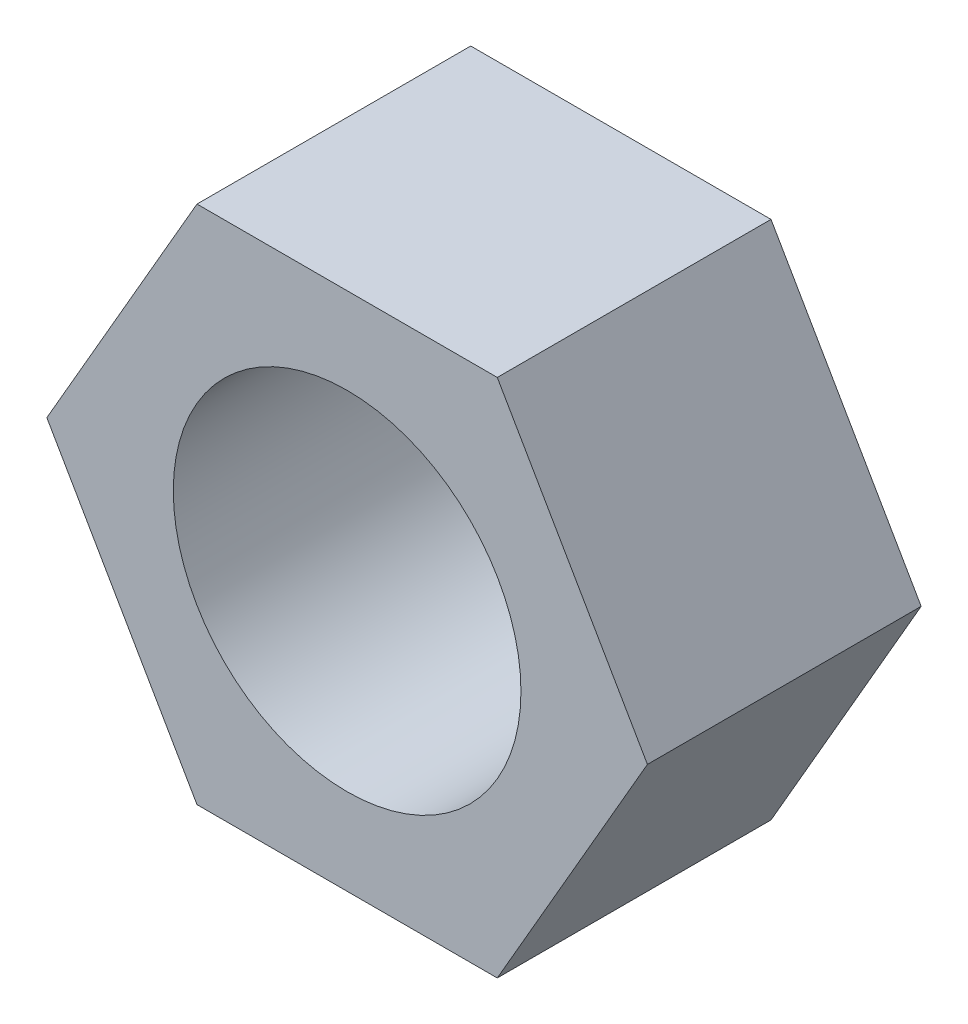
ISO-10303-21;
HEADER;
FILE_DESCRIPTION(('STEP AP214'),'2;1');
FILE_NAME('part.step','',(''),(''),'','','');
FILE_SCHEMA(('AUTOMOTIVE_DESIGN { 1 0 10303 214 1 1 1 1 }'));
ENDSEC;
DATA;
#1=APPLICATION_CONTEXT('core data for automotive mechanical design processes');
#2=APPLICATION_PROTOCOL_DEFINITION('international standard','automotive_design',2000,#1);
#3=PRODUCT_CONTEXT('',#1,'mechanical');
#4=PRODUCT('Part','Part','',(#3));
#5=PRODUCT_RELATED_PRODUCT_CATEGORY('part','',(#4));
#6=PRODUCT_DEFINITION_FORMATION('','',#4);
#7=PRODUCT_DEFINITION_CONTEXT('part definition',#1,'design');
#8=PRODUCT_DEFINITION('design','',#6,#7);
#9=PRODUCT_DEFINITION_SHAPE('','',#8);
#10=(LENGTH_UNIT() NAMED_UNIT(*) SI_UNIT(.MILLI.,.METRE.));
#11=(NAMED_UNIT(*) PLANE_ANGLE_UNIT() SI_UNIT($,.RADIAN.));
#12=(NAMED_UNIT(*) SI_UNIT($,.STERADIAN.) SOLID_ANGLE_UNIT());
#13=UNCERTAINTY_MEASURE_WITH_UNIT(LENGTH_MEASURE(1.E-05),#10,'distance_accuracy_value','');
#14=(GEOMETRIC_REPRESENTATION_CONTEXT(3) GLOBAL_UNCERTAINTY_ASSIGNED_CONTEXT((#13)) GLOBAL_UNIT_ASSIGNED_CONTEXT((#10,
#11,#12)) REPRESENTATION_CONTEXT('',''));
#15=CARTESIAN_POINT('',(0.,0.,0.));
#16=DIRECTION('',(0.,0.,1.));
#17=DIRECTION('',(1.,0.,0.));
#18=AXIS2_PLACEMENT_3D('',#15,#16,#17);
#19=CARTESIAN_POINT('',(5.48482755730145,-9.5,40.));
#20=DIRECTION('',(-0.866025403784439,0.5,0.));
#21=DIRECTION('',(-0.5,-0.866025403784439,0.));
#22=AXIS2_PLACEMENT_3D('',#19,#20,#21);
#23=PLANE('',#22);
#24=DIRECTION('',(0.5,0.866025403784439,0.));
#25=VECTOR('',#24,1.);
#26=CARTESIAN_POINT('',(5.48482755730145,-9.5,30.));
#27=LINE('',#26,#25);
#28=CARTESIAN_POINT('',(5.48482755730145,-9.5,30.));
#29=VERTEX_POINT('',#28);
#30=CARTESIAN_POINT('',(10.9696551146029,0.,30.));
#31=VERTEX_POINT('',#30);
#32=EDGE_CURVE('E117',#29,#31,#27,.T.);
#33=ORIENTED_EDGE('',*,*,#32,.T.);
#34=DIRECTION('',(0.,0.,-1.));
#35=VECTOR('',#34,1.);
#36=CARTESIAN_POINT('',(10.9696551146029,0.,40.));
#37=LINE('',#36,#35);
#38=CARTESIAN_POINT('',(10.9696551146029,0.,40.));
#39=VERTEX_POINT('',#38);
#40=EDGE_CURVE('E11',#39,#31,#37,.T.);
#41=ORIENTED_EDGE('',*,*,#40,.F.);
#42=DIRECTION('',(0.5,0.866025403784439,0.));
#43=VECTOR('',#42,1.);
#44=CARTESIAN_POINT('',(5.48482755730145,-9.5,40.));
#45=LINE('',#44,#43);
#46=CARTESIAN_POINT('',(5.48482755730145,-9.5,40.));
#47=VERTEX_POINT('',#46);
#48=EDGE_CURVE('E128',#47,#39,#45,.T.);
#49=ORIENTED_EDGE('',*,*,#48,.F.);
#50=DIRECTION('',(0.,0.,-1.));
#51=VECTOR('',#50,1.);
#52=CARTESIAN_POINT('',(5.48482755730145,-9.5,40.));
#53=LINE('',#52,#51);
#54=EDGE_CURVE('E113',#47,#29,#53,.T.);
#55=ORIENTED_EDGE('',*,*,#54,.T.);
#56=EDGE_LOOP('',(#33,#41,#49,#55));
#57=FACE_BOUND('',#56,.T.);
#58=ADVANCED_FACE('F33',(#57),#23,.F.);
#59=CARTESIAN_POINT('',(10.9696551146029,0.,40.));
#60=DIRECTION('',(-0.866025403784438,-0.5,0.));
#61=DIRECTION('',(0.5,-0.866025403784439,0.));
#62=AXIS2_PLACEMENT_3D('',#59,#60,#61);
#63=PLANE('',#62);
#64=DIRECTION('',(-0.5,0.866025403784438,0.));
#65=VECTOR('',#64,1.);
#66=CARTESIAN_POINT('',(10.9696551146029,0.,30.));
#67=LINE('',#66,#65);
#68=CARTESIAN_POINT('',(5.48482755730144,9.5,30.));
#69=VERTEX_POINT('',#68);
#70=EDGE_CURVE('E120',#31,#69,#67,.T.);
#71=ORIENTED_EDGE('',*,*,#70,.T.);
#72=DIRECTION('',(0.,0.,-1.));
#73=VECTOR('',#72,1.);
#74=CARTESIAN_POINT('',(5.48482755730144,9.5,40.));
#75=LINE('',#74,#73);
#76=CARTESIAN_POINT('',(5.48482755730144,9.5,40.));
#77=VERTEX_POINT('',#76);
#78=EDGE_CURVE('E41',#77,#69,#75,.T.);
#79=ORIENTED_EDGE('',*,*,#78,.F.);
#80=DIRECTION('',(-0.5,0.866025403784438,0.));
#81=VECTOR('',#80,1.);
#82=CARTESIAN_POINT('',(10.9696551146029,0.,40.));
#83=LINE('',#82,#81);
#84=EDGE_CURVE('E86',#39,#77,#83,.T.);
#85=ORIENTED_EDGE('',*,*,#84,.F.);
#86=ORIENTED_EDGE('',*,*,#40,.T.);
#87=EDGE_LOOP('',(#71,#79,#85,#86));
#88=FACE_BOUND('',#87,.T.);
#89=ADVANCED_FACE('F153',(#88),#63,.F.);
#90=CARTESIAN_POINT('',(5.48482755730144,9.5,40.));
#91=DIRECTION('',(0.,-1.,0.));
#92=DIRECTION('',(1.,0.,0.));
#93=AXIS2_PLACEMENT_3D('',#90,#91,#92);
#94=PLANE('',#93);
#95=DIRECTION('',(-1.,0.,0.));
#96=VECTOR('',#95,1.);
#97=CARTESIAN_POINT('',(5.48482755730144,9.5,30.));
#98=LINE('',#97,#96);
#99=CARTESIAN_POINT('',(-5.48482755730145,9.5,30.));
#100=VERTEX_POINT('',#99);
#101=EDGE_CURVE('E123',#69,#100,#98,.T.);
#102=ORIENTED_EDGE('',*,*,#101,.T.);
#103=DIRECTION('',(0.,0.,-1.));
#104=VECTOR('',#103,1.);
#105=CARTESIAN_POINT('',(-5.48482755730145,9.5,40.));
#106=LINE('',#105,#104);
#107=CARTESIAN_POINT('',(-5.48482755730145,9.5,40.));
#108=VERTEX_POINT('',#107);
#109=EDGE_CURVE('E108',#108,#100,#106,.T.);
#110=ORIENTED_EDGE('',*,*,#109,.F.);
#111=DIRECTION('',(-1.,0.,0.));
#112=VECTOR('',#111,1.);
#113=CARTESIAN_POINT('',(5.48482755730144,9.5,40.));
#114=LINE('',#113,#112);
#115=EDGE_CURVE('E99',#77,#108,#114,.T.);
#116=ORIENTED_EDGE('',*,*,#115,.F.);
#117=ORIENTED_EDGE('',*,*,#78,.T.);
#118=EDGE_LOOP('',(#102,#110,#116,#117));
#119=FACE_BOUND('',#118,.T.);
#120=ADVANCED_FACE('F134',(#119),#94,.F.);
#121=CARTESIAN_POINT('',(-5.48482755730145,9.5,40.));
#122=DIRECTION('',(0.866025403784439,-0.5,0.));
#123=DIRECTION('',(0.5,0.866025403784439,0.));
#124=AXIS2_PLACEMENT_3D('',#121,#122,#123);
#125=PLANE('',#124);
#126=DIRECTION('',(-0.5,-0.866025403784439,0.));
#127=VECTOR('',#126,1.);
#128=CARTESIAN_POINT('',(-5.48482755730145,9.5,30.));
#129=LINE('',#128,#127);
#130=CARTESIAN_POINT('',(-10.9696551146029,0.,30.));
#131=VERTEX_POINT('',#130);
#132=EDGE_CURVE('E107',#100,#131,#129,.T.);
#133=ORIENTED_EDGE('',*,*,#132,.T.);
#134=DIRECTION('',(0.,0.,-1.));
#135=VECTOR('',#134,1.);
#136=CARTESIAN_POINT('',(-10.9696551146029,0.,40.));
#137=LINE('',#136,#135);
#138=CARTESIAN_POINT('',(-10.9696551146029,0.,40.));
#139=VERTEX_POINT('',#138);
#140=EDGE_CURVE('E104',#139,#131,#137,.T.);
#141=ORIENTED_EDGE('',*,*,#140,.F.);
#142=DIRECTION('',(-0.5,-0.866025403784439,0.));
#143=VECTOR('',#142,1.);
#144=CARTESIAN_POINT('',(-5.48482755730145,9.5,40.));
#145=LINE('',#144,#143);
#146=EDGE_CURVE('E93',#108,#139,#145,.T.);
#147=ORIENTED_EDGE('',*,*,#146,.F.);
#148=ORIENTED_EDGE('',*,*,#109,.T.);
#149=EDGE_LOOP('',(#133,#141,#147,#148));
#150=FACE_BOUND('',#149,.T.);
#151=ADVANCED_FACE('F105',(#150),#125,.F.);
#152=CARTESIAN_POINT('',(-10.9696551146029,0.,40.));
#153=DIRECTION('',(0.866025403784439,0.5,0.));
#154=DIRECTION('',(-0.5,0.866025403784439,0.));
#155=AXIS2_PLACEMENT_3D('',#152,#153,#154);
#156=PLANE('',#155);
#157=DIRECTION('',(0.5,-0.866025403784439,0.));
#158=VECTOR('',#157,1.);
#159=CARTESIAN_POINT('',(-10.9696551146029,0.,30.));
#160=LINE('',#159,#158);
#161=CARTESIAN_POINT('',(-5.48482755730145,-9.5,30.));
#162=VERTEX_POINT('',#161);
#163=EDGE_CURVE('E72',#131,#162,#160,.T.);
#164=ORIENTED_EDGE('',*,*,#163,.T.);
#165=DIRECTION('',(0.,0.,-1.));
#166=VECTOR('',#165,1.);
#167=CARTESIAN_POINT('',(-5.48482755730145,-9.5,40.));
#168=LINE('',#167,#166);
#169=CARTESIAN_POINT('',(-5.48482755730145,-9.5,40.));
#170=VERTEX_POINT('',#169);
#171=EDGE_CURVE('E109',#170,#162,#168,.T.);
#172=ORIENTED_EDGE('',*,*,#171,.F.);
#173=DIRECTION('',(0.5,-0.866025403784439,0.));
#174=VECTOR('',#173,1.);
#175=CARTESIAN_POINT('',(-10.9696551146029,0.,40.));
#176=LINE('',#175,#174);
#177=EDGE_CURVE('E97',#139,#170,#176,.T.);
#178=ORIENTED_EDGE('',*,*,#177,.F.);
#179=ORIENTED_EDGE('',*,*,#140,.T.);
#180=EDGE_LOOP('',(#164,#172,#178,#179));
#181=FACE_BOUND('',#180,.T.);
#182=ADVANCED_FACE('F111',(#181),#156,.F.);
#183=CARTESIAN_POINT('',(-5.48482755730145,-9.5,40.));
#184=DIRECTION('',(0.,1.,0.));
#185=DIRECTION('',(0.,0.,1.));
#186=AXIS2_PLACEMENT_3D('',#183,#184,#185);
#187=PLANE('',#186);
#188=DIRECTION('',(1.,0.,0.));
#189=VECTOR('',#188,1.);
#190=CARTESIAN_POINT('',(-5.48482755730145,-9.5,30.));
#191=LINE('',#190,#189);
#192=EDGE_CURVE('E78',#162,#29,#191,.T.);
#193=ORIENTED_EDGE('',*,*,#192,.T.);
#194=ORIENTED_EDGE('',*,*,#54,.F.);
#195=DIRECTION('',(1.,0.,0.));
#196=VECTOR('',#195,1.);
#197=CARTESIAN_POINT('',(-5.48482755730145,-9.5,40.));
#198=LINE('',#197,#196);
#199=EDGE_CURVE('E49',#170,#47,#198,.T.);
#200=ORIENTED_EDGE('',*,*,#199,.F.);
#201=ORIENTED_EDGE('',*,*,#171,.T.);
#202=EDGE_LOOP('',(#193,#194,#200,#201));
#203=FACE_BOUND('',#202,.T.);
#204=ADVANCED_FACE('F141',(#203),#187,.F.);
#205=CARTESIAN_POINT('',(0.,0.,40.));
#206=DIRECTION('',(0.,0.,1.));
#207=DIRECTION('',(1.,0.,0.));
#208=AXIS2_PLACEMENT_3D('',#205,#206,#207);
#209=PLANE('',#208);
#210=CARTESIAN_POINT('',(0.,0.,40.));
#211=DIRECTION('',(0.,0.,-1.));
#212=DIRECTION('',(-1.,0.,0.));
#213=AXIS2_PLACEMENT_3D('',#210,#211,#212);
#214=CIRCLE('',#213,6.35);
#215=CARTESIAN_POINT('',(-6.35,0.,40.));
#216=VERTEX_POINT('',#215);
#217=EDGE_CURVE('E206',#216,#216,#214,.T.);
#218=ORIENTED_EDGE('',*,*,#217,.T.);
#219=EDGE_LOOP('',(#218));
#220=FACE_BOUND('',#219,.T.);
#221=ORIENTED_EDGE('',*,*,#48,.T.);
#222=ORIENTED_EDGE('',*,*,#84,.T.);
#223=ORIENTED_EDGE('',*,*,#115,.T.);
#224=ORIENTED_EDGE('',*,*,#146,.T.);
#225=ORIENTED_EDGE('',*,*,#177,.T.);
#226=ORIENTED_EDGE('',*,*,#199,.T.);
#227=EDGE_LOOP('',(#221,#222,#223,#224,#225,#226));
#228=FACE_BOUND('',#227,.T.);
#229=ADVANCED_FACE('F95',(#220,#228),#209,.T.);
#230=CARTESIAN_POINT('',(0.,0.,30.));
#231=DIRECTION('',(0.,0.,1.));
#232=DIRECTION('',(1.,0.,0.));
#233=AXIS2_PLACEMENT_3D('',#230,#231,#232);
#234=PLANE('',#233);
#235=CARTESIAN_POINT('',(0.,0.,30.));
#236=DIRECTION('',(0.,0.,1.));
#237=DIRECTION('',(1.,0.,0.));
#238=AXIS2_PLACEMENT_3D('',#235,#236,#237);
#239=CIRCLE('',#238,6.35);
#240=CARTESIAN_POINT('',(6.35,0.,30.));
#241=VERTEX_POINT('',#240);
#242=EDGE_CURVE('E121',#241,#241,#239,.T.);
#243=ORIENTED_EDGE('',*,*,#242,.T.);
#244=EDGE_LOOP('',(#243));
#245=FACE_BOUND('',#244,.T.);
#246=ORIENTED_EDGE('',*,*,#32,.F.);
#247=ORIENTED_EDGE('',*,*,#192,.F.);
#248=ORIENTED_EDGE('',*,*,#163,.F.);
#249=ORIENTED_EDGE('',*,*,#132,.F.);
#250=ORIENTED_EDGE('',*,*,#101,.F.);
#251=ORIENTED_EDGE('',*,*,#70,.F.);
#252=EDGE_LOOP('',(#246,#247,#248,#249,#250,#251));
#253=FACE_BOUND('',#252,.T.);
#254=ADVANCED_FACE('F137',(#245,#253),#234,.F.);
#255=CARTESIAN_POINT('',(0.,0.,40.));
#256=DIRECTION('',(0.,0.,-1.));
#257=DIRECTION('',(-1.,0.,0.));
#258=AXIS2_PLACEMENT_3D('',#255,#256,#257);
#259=CYLINDRICAL_SURFACE('',#258,6.35);
#260=ORIENTED_EDGE('',*,*,#217,.F.);
#261=EDGE_LOOP('',(#260));
#262=FACE_BOUND('',#261,.T.);
#263=ORIENTED_EDGE('',*,*,#242,.F.);
#264=EDGE_LOOP('',(#263));
#265=FACE_BOUND('',#264,.T.);
#266=ADVANCED_FACE('F185',(#262,#265),#259,.F.);
#267=CLOSED_SHELL('',(#58,#89,#120,#151,#182,#204,#229,#254,#266));
#268=MANIFOLD_SOLID_BREP('B2',#267);
#269=ADVANCED_BREP_SHAPE_REPRESENTATION('',(#18,#268),#14);
#270=SHAPE_DEFINITION_REPRESENTATION(#9,#269);
ENDSEC;
END-ISO-10303-21;
